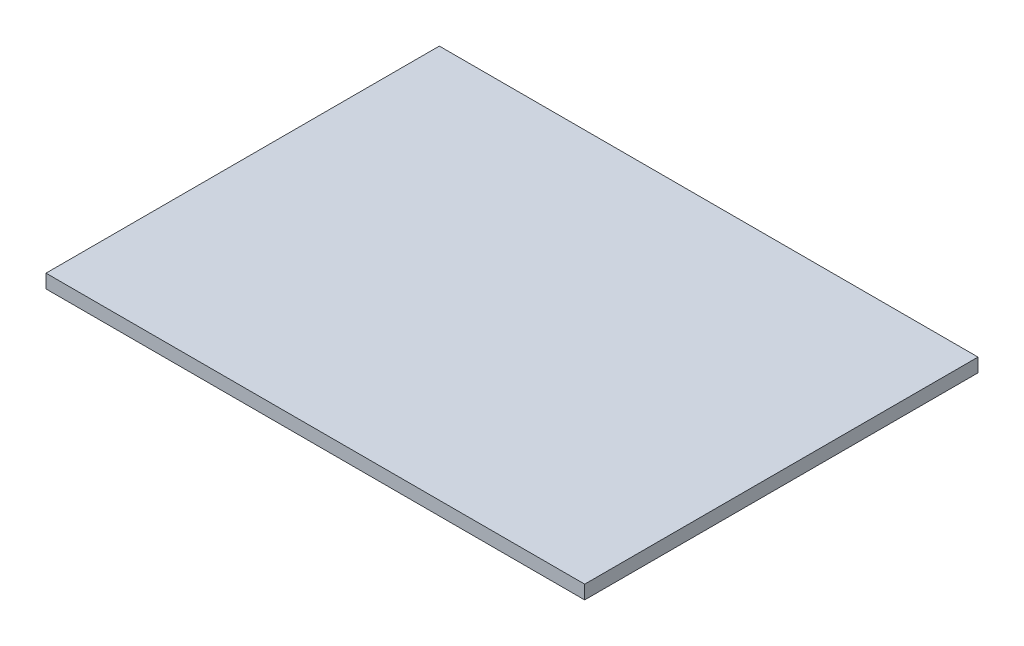
ISO-10303-21;
HEADER;
FILE_DESCRIPTION(('STEP AP214'),'2;1');
FILE_NAME('part.step','',(''),(''),'','','');
FILE_SCHEMA(('AUTOMOTIVE_DESIGN { 1 0 10303 214 1 1 1 1 }'));
ENDSEC;
DATA;
#1=APPLICATION_CONTEXT('core data for automotive mechanical design processes');
#2=APPLICATION_PROTOCOL_DEFINITION('international standard','automotive_design',2000,#1);
#3=PRODUCT_CONTEXT('',#1,'mechanical');
#4=PRODUCT('Part','Part','',(#3));
#5=PRODUCT_RELATED_PRODUCT_CATEGORY('part','',(#4));
#6=PRODUCT_DEFINITION_FORMATION('','',#4);
#7=PRODUCT_DEFINITION_CONTEXT('part definition',#1,'design');
#8=PRODUCT_DEFINITION('design','',#6,#7);
#9=PRODUCT_DEFINITION_SHAPE('','',#8);
#10=(LENGTH_UNIT() NAMED_UNIT(*) SI_UNIT(.MILLI.,.METRE.));
#11=(NAMED_UNIT(*) PLANE_ANGLE_UNIT() SI_UNIT($,.RADIAN.));
#12=(NAMED_UNIT(*) SI_UNIT($,.STERADIAN.) SOLID_ANGLE_UNIT());
#13=UNCERTAINTY_MEASURE_WITH_UNIT(LENGTH_MEASURE(1.E-05),#10,'distance_accuracy_value','');
#14=(GEOMETRIC_REPRESENTATION_CONTEXT(3) GLOBAL_UNCERTAINTY_ASSIGNED_CONTEXT((#13)) GLOBAL_UNIT_ASSIGNED_CONTEXT((#10,
#11,#12)) REPRESENTATION_CONTEXT('',''));
#15=CARTESIAN_POINT('',(0.,0.,0.));
#16=DIRECTION('',(0.,0.,1.));
#17=DIRECTION('',(1.,0.,0.));
#18=AXIS2_PLACEMENT_3D('',#15,#16,#17);
#19=CARTESIAN_POINT('',(0.,1.6,0.));
#20=DIRECTION('',(1.,0.,0.));
#21=DIRECTION('',(0.,0.,-1.));
#22=AXIS2_PLACEMENT_3D('',#19,#20,#21);
#23=PLANE('',#22);
#24=DIRECTION('',(0.,0.,1.));
#25=VECTOR('',#24,1.);
#26=CARTESIAN_POINT('',(0.,0.,0.));
#27=LINE('',#26,#25);
#28=CARTESIAN_POINT('',(0.,0.,-46.));
#29=VERTEX_POINT('',#28);
#30=CARTESIAN_POINT('',(0.,0.,0.));
#31=VERTEX_POINT('',#30);
#32=EDGE_CURVE('E111',#29,#31,#27,.T.);
#33=ORIENTED_EDGE('',*,*,#32,.T.);
#34=DIRECTION('',(0.,-1.,0.));
#35=VECTOR('',#34,1.);
#36=CARTESIAN_POINT('',(0.,1.6,0.));
#37=LINE('',#36,#35);
#38=CARTESIAN_POINT('',(0.,1.6,0.));
#39=VERTEX_POINT('',#38);
#40=EDGE_CURVE('E11',#39,#31,#37,.T.);
#41=ORIENTED_EDGE('',*,*,#40,.F.);
#42=DIRECTION('',(0.,0.,1.));
#43=VECTOR('',#42,1.);
#44=CARTESIAN_POINT('',(0.,1.6,0.));
#45=LINE('',#44,#43);
#46=CARTESIAN_POINT('',(0.,1.6,-46.));
#47=VERTEX_POINT('',#46);
#48=EDGE_CURVE('E100',#47,#39,#45,.T.);
#49=ORIENTED_EDGE('',*,*,#48,.F.);
#50=DIRECTION('',(0.,-1.,0.));
#51=VECTOR('',#50,1.);
#52=CARTESIAN_POINT('',(0.,1.6,-46.));
#53=LINE('',#52,#51);
#54=EDGE_CURVE('E107',#47,#29,#53,.T.);
#55=ORIENTED_EDGE('',*,*,#54,.T.);
#56=EDGE_LOOP('',(#33,#41,#49,#55));
#57=FACE_BOUND('',#56,.T.);
#58=ADVANCED_FACE('F44',(#57),#23,.F.);
#59=CARTESIAN_POINT('',(0.,1.6,0.));
#60=DIRECTION('',(0.,0.,-1.));
#61=DIRECTION('',(-1.,0.,0.));
#62=AXIS2_PLACEMENT_3D('',#59,#60,#61);
#63=PLANE('',#62);
#64=DIRECTION('',(1.,0.,0.));
#65=VECTOR('',#64,1.);
#66=CARTESIAN_POINT('',(0.,0.,0.));
#67=LINE('',#66,#65);
#68=CARTESIAN_POINT('',(63.,0.,0.));
#69=VERTEX_POINT('',#68);
#70=EDGE_CURVE('E105',#31,#69,#67,.T.);
#71=ORIENTED_EDGE('',*,*,#70,.T.);
#72=DIRECTION('',(0.,-1.,0.));
#73=VECTOR('',#72,1.);
#74=CARTESIAN_POINT('',(63.,1.6,0.));
#75=LINE('',#74,#73);
#76=CARTESIAN_POINT('',(63.,1.6,0.));
#77=VERTEX_POINT('',#76);
#78=EDGE_CURVE('E53',#77,#69,#75,.T.);
#79=ORIENTED_EDGE('',*,*,#78,.F.);
#80=DIRECTION('',(1.,0.,0.));
#81=VECTOR('',#80,1.);
#82=CARTESIAN_POINT('',(0.,1.6,0.));
#83=LINE('',#82,#81);
#84=EDGE_CURVE('E95',#39,#77,#83,.T.);
#85=ORIENTED_EDGE('',*,*,#84,.F.);
#86=ORIENTED_EDGE('',*,*,#40,.T.);
#87=EDGE_LOOP('',(#71,#79,#85,#86));
#88=FACE_BOUND('',#87,.T.);
#89=ADVANCED_FACE('F102',(#88),#63,.F.);
#90=CARTESIAN_POINT('',(63.,1.6,0.));
#91=DIRECTION('',(-1.,0.,0.));
#92=DIRECTION('',(0.,0.,1.));
#93=AXIS2_PLACEMENT_3D('',#90,#91,#92);
#94=PLANE('',#93);
#95=DIRECTION('',(0.,0.,-1.));
#96=VECTOR('',#95,1.);
#97=CARTESIAN_POINT('',(63.,0.,0.));
#98=LINE('',#97,#96);
#99=CARTESIAN_POINT('',(63.,0.,-46.));
#100=VERTEX_POINT('',#99);
#101=EDGE_CURVE('E80',#69,#100,#98,.T.);
#102=ORIENTED_EDGE('',*,*,#101,.T.);
#103=DIRECTION('',(0.,-1.,0.));
#104=VECTOR('',#103,1.);
#105=CARTESIAN_POINT('',(63.,1.6,-46.));
#106=LINE('',#105,#104);
#107=CARTESIAN_POINT('',(63.,1.6,-46.));
#108=VERTEX_POINT('',#107);
#109=EDGE_CURVE('E101',#108,#100,#106,.T.);
#110=ORIENTED_EDGE('',*,*,#109,.F.);
#111=DIRECTION('',(0.,0.,-1.));
#112=VECTOR('',#111,1.);
#113=CARTESIAN_POINT('',(63.,1.6,0.));
#114=LINE('',#113,#112);
#115=EDGE_CURVE('E94',#77,#108,#114,.T.);
#116=ORIENTED_EDGE('',*,*,#115,.F.);
#117=ORIENTED_EDGE('',*,*,#78,.T.);
#118=EDGE_LOOP('',(#102,#110,#116,#117));
#119=FACE_BOUND('',#118,.T.);
#120=ADVANCED_FACE('F103',(#119),#94,.F.);
#121=CARTESIAN_POINT('',(0.,1.6,-46.));
#122=DIRECTION('',(0.,0.,1.));
#123=DIRECTION('',(1.,0.,0.));
#124=AXIS2_PLACEMENT_3D('',#121,#122,#123);
#125=PLANE('',#124);
#126=DIRECTION('',(-1.,0.,0.));
#127=VECTOR('',#126,1.);
#128=CARTESIAN_POINT('',(0.,0.,-46.));
#129=LINE('',#128,#127);
#130=EDGE_CURVE('E82',#100,#29,#129,.T.);
#131=ORIENTED_EDGE('',*,*,#130,.T.);
#132=ORIENTED_EDGE('',*,*,#54,.F.);
#133=DIRECTION('',(-1.,0.,0.));
#134=VECTOR('',#133,1.);
#135=CARTESIAN_POINT('',(0.,1.6,-46.));
#136=LINE('',#135,#134);
#137=EDGE_CURVE('E65',#108,#47,#136,.T.);
#138=ORIENTED_EDGE('',*,*,#137,.F.);
#139=ORIENTED_EDGE('',*,*,#109,.T.);
#140=EDGE_LOOP('',(#131,#132,#138,#139));
#141=FACE_BOUND('',#140,.T.);
#142=ADVANCED_FACE('F128',(#141),#125,.F.);
#143=CARTESIAN_POINT('',(0.,1.6,0.));
#144=DIRECTION('',(0.,-1.,0.));
#145=DIRECTION('',(0.,0.,-1.));
#146=AXIS2_PLACEMENT_3D('',#143,#144,#145);
#147=PLANE('',#146);
#148=ORIENTED_EDGE('',*,*,#48,.T.);
#149=ORIENTED_EDGE('',*,*,#84,.T.);
#150=ORIENTED_EDGE('',*,*,#115,.T.);
#151=ORIENTED_EDGE('',*,*,#137,.T.);
#152=EDGE_LOOP('',(#148,#149,#150,#151));
#153=FACE_BOUND('',#152,.T.);
#154=ADVANCED_FACE('F93',(#153),#147,.F.);
#155=CARTESIAN_POINT('',(0.,0.,0.));
#156=DIRECTION('',(0.,-1.,0.));
#157=DIRECTION('',(0.,0.,-1.));
#158=AXIS2_PLACEMENT_3D('',#155,#156,#157);
#159=PLANE('',#158);
#160=ORIENTED_EDGE('',*,*,#32,.F.);
#161=ORIENTED_EDGE('',*,*,#130,.F.);
#162=ORIENTED_EDGE('',*,*,#101,.F.);
#163=ORIENTED_EDGE('',*,*,#70,.F.);
#164=EDGE_LOOP('',(#160,#161,#162,#163));
#165=FACE_BOUND('',#164,.T.);
#166=ADVANCED_FACE('F129',(#165),#159,.T.);
#167=CLOSED_SHELL('',(#58,#89,#120,#142,#154,#166));
#168=MANIFOLD_SOLID_BREP('B2',#167);
#169=ADVANCED_BREP_SHAPE_REPRESENTATION('',(#18,#168),#14);
#170=SHAPE_DEFINITION_REPRESENTATION(#9,#169);
ENDSEC;
END-ISO-10303-21;
